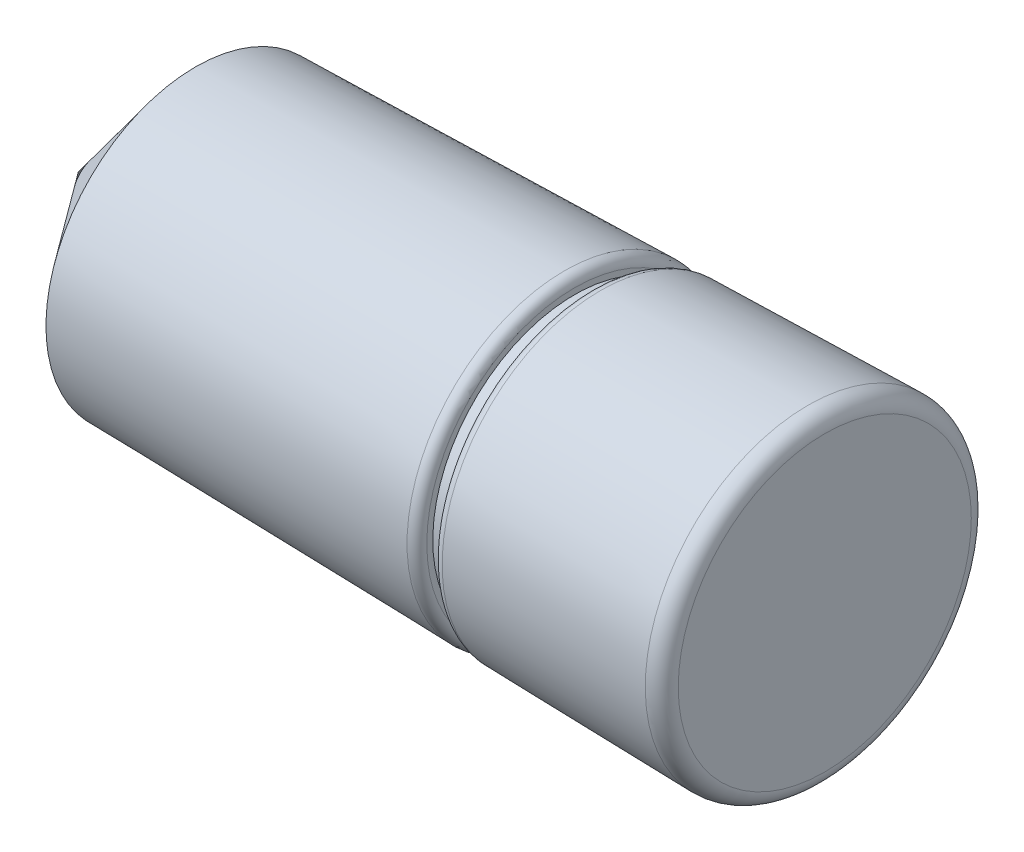
ISO-10303-21;
HEADER;
FILE_DESCRIPTION(('STEP AP214'),'2;1');
FILE_NAME('part.step','',(''),(''),'','','');
FILE_SCHEMA(('AUTOMOTIVE_DESIGN { 1 0 10303 214 1 1 1 1 }'));
ENDSEC;
DATA;
#1=APPLICATION_CONTEXT('core data for automotive mechanical design processes');
#2=APPLICATION_PROTOCOL_DEFINITION('international standard','automotive_design',2000,#1);
#3=PRODUCT_CONTEXT('',#1,'mechanical');
#4=PRODUCT('Part','Part','',(#3));
#5=PRODUCT_RELATED_PRODUCT_CATEGORY('part','',(#4));
#6=PRODUCT_DEFINITION_FORMATION('','',#4);
#7=PRODUCT_DEFINITION_CONTEXT('part definition',#1,'design');
#8=PRODUCT_DEFINITION('design','',#6,#7);
#9=PRODUCT_DEFINITION_SHAPE('','',#8);
#10=(LENGTH_UNIT() NAMED_UNIT(*) SI_UNIT(.MILLI.,.METRE.));
#11=(NAMED_UNIT(*) PLANE_ANGLE_UNIT() SI_UNIT($,.RADIAN.));
#12=(NAMED_UNIT(*) SI_UNIT($,.STERADIAN.) SOLID_ANGLE_UNIT());
#13=UNCERTAINTY_MEASURE_WITH_UNIT(LENGTH_MEASURE(1.E-05),#10,'distance_accuracy_value','');
#14=(GEOMETRIC_REPRESENTATION_CONTEXT(3) GLOBAL_UNCERTAINTY_ASSIGNED_CONTEXT((#13)) GLOBAL_UNIT_ASSIGNED_CONTEXT((#10,
#11,#12)) REPRESENTATION_CONTEXT('',''));
#15=CARTESIAN_POINT('',(0.,0.,0.));
#16=DIRECTION('',(0.,0.,1.));
#17=DIRECTION('',(1.,0.,0.));
#18=AXIS2_PLACEMENT_3D('',#15,#16,#17);
#19=CARTESIAN_POINT('',(534.155129661409,153.717367655894,0.));
#20=DIRECTION('',(-0.999999998221423,-5.96418779812159E-05,0.));
#21=DIRECTION('',(5.96418779812159E-05,-0.999999998221423,0.));
#22=AXIS2_PLACEMENT_3D('',#19,#20,#21);
#23=CONICAL_SURFACE('',#22,14.2530304578427,1.57073668491688);
#24=CARTESIAN_POINT('',(534.155979738912,153.717367706594,0.));
#25=VERTEX_POINT('',#24);
#26=VERTEX_LOOP('',#25);
#27=FACE_BOUND('',#26,.T.);
#28=CARTESIAN_POINT('',(534.155129661409,153.717367655894,0.));
#29=DIRECTION('',(0.999999998221423,5.96418779812159E-05,0.));
#30=DIRECTION('',(-5.96418779812159E-05,0.999999998221423,0.));
#31=AXIS2_PLACEMENT_3D('',#28,#29,#30);
#32=CIRCLE('',#31,14.2530304578427);
#33=CARTESIAN_POINT('',(534.154279583905,167.970398088386,0.));
#34=VERTEX_POINT('',#33);
#35=EDGE_CURVE('E11',#34,#34,#32,.T.);
#36=ORIENTED_EDGE('',*,*,#35,.T.);
#37=EDGE_LOOP('',(#36));
#38=FACE_BOUND('',#37,.T.);
#39=ADVANCED_FACE('F33',(#27,#38),#23,.T.);
#40=CARTESIAN_POINT('',(532.567629667056,153.717272974412,0.));
#41=DIRECTION('',(0.999999998221423,5.96418779812159E-05,0.));
#42=DIRECTION('',(-5.96418779812159E-05,0.999999998221423,0.));
#43=AXIS2_PLACEMENT_3D('',#40,#41,#42);
#44=TOROIDAL_SURFACE('',#43,14.2529357763614,1.58749999999998);
#45=ORIENTED_EDGE('',*,*,#35,.F.);
#46=EDGE_LOOP('',(#45));
#47=FACE_BOUND('',#46,.T.);
#48=CARTESIAN_POINT('',(532.533439624122,153.717270935254,0.));
#49=DIRECTION('',(0.999999998221423,5.96418779812159E-05,0.));
#50=DIRECTION('',(-5.96418779812159E-05,0.999999998221423,0.));
#51=AXIS2_PLACEMENT_3D('',#48,#49,#50);
#52=CIRCLE('',#51,15.8400675575818);
#53=CARTESIAN_POINT('',(532.532494892745,169.557338464663,0.));
#54=VERTEX_POINT('',#53);
#55=EDGE_CURVE('E40',#54,#54,#52,.T.);
#56=ORIENTED_EDGE('',*,*,#55,.T.);
#57=EDGE_LOOP('',(#56));
#58=FACE_BOUND('',#57,.T.);
#59=ADVANCED_FACE('F48',(#47,#58),#44,.T.);
#60=CARTESIAN_POINT('',(512.340427262318,153.716066586073,0.));
#61=DIRECTION('',(0.999999998221423,5.96418779812159E-05,0.));
#62=DIRECTION('',(-5.96418779812159E-05,0.999999998221423,0.));
#63=AXIS2_PLACEMENT_3D('',#60,#61,#62);
#64=CONICAL_SURFACE('',#63,15.4050690462788,0.0215387002752738);
#65=CARTESIAN_POINT('',(512.340427262318,153.716066586073,0.));
#66=DIRECTION('',(0.999999998221423,5.96418779812159E-05,0.));
#67=DIRECTION('',(-5.96418779812159E-05,0.999999998221423,0.));
#68=AXIS2_PLACEMENT_3D('',#65,#66,#67);
#69=CIRCLE('',#68,15.4050690462788);
#70=CARTESIAN_POINT('',(512.33950847507,169.121135604952,0.));
#71=VERTEX_POINT('',#70);
#72=EDGE_CURVE('E57',#71,#71,#69,.T.);
#73=CARTESIAN_POINT('',(532.532494892745,169.557338464663,0.));
#74=CARTESIAN_POINT('',(532.322151284228,169.552794684874,0.));
#75=CARTESIAN_POINT('',(532.11180767571,169.548250905086,0.));
#76=CARTESIAN_POINT('',(531.691120458676,169.539163345509,0.));
#77=CARTESIAN_POINT('',(531.480776850158,169.53461956572,0.));
#78=CARTESIAN_POINT('',(531.060089633123,169.525532006143,0.));
#79=CARTESIAN_POINT('',(530.849746024606,169.520988226354,0.));
#80=CARTESIAN_POINT('',(530.429058807571,169.511900666777,0.));
#81=CARTESIAN_POINT('',(530.218715199053,169.507356886988,0.));
#82=CARTESIAN_POINT('',(529.798027982018,169.498269327411,0.));
#83=CARTESIAN_POINT('',(529.587684373501,169.493725547622,0.));
#84=CARTESIAN_POINT('',(529.166997156466,169.484637988045,0.));
#85=CARTESIAN_POINT('',(528.956653547949,169.480094208256,0.));
#86=CARTESIAN_POINT('',(528.535966330914,169.471006648679,0.));
#87=CARTESIAN_POINT('',(528.325622722396,169.46646286889,0.));
#88=CARTESIAN_POINT('',(527.904935505361,169.457375309313,0.));
#89=CARTESIAN_POINT('',(527.694591896844,169.452831529524,0.));
#90=CARTESIAN_POINT('',(527.273904679809,169.443743969947,0.));
#91=CARTESIAN_POINT('',(527.063561071292,169.439200190158,0.));
#92=CARTESIAN_POINT('',(526.642873854257,169.430112630581,0.));
#93=CARTESIAN_POINT('',(526.432530245739,169.425568850792,0.));
#94=CARTESIAN_POINT('',(526.011843028704,169.416481291215,0.));
#95=CARTESIAN_POINT('',(525.801499420187,169.411937511426,0.));
#96=CARTESIAN_POINT('',(525.380812203152,169.402849951849,0.));
#97=CARTESIAN_POINT('',(525.170468594634,169.39830617206,0.));
#98=CARTESIAN_POINT('',(524.7497813776,169.389218612483,0.));
#99=CARTESIAN_POINT('',(524.539437769082,169.384674832694,0.));
#100=CARTESIAN_POINT('',(524.118750552047,169.375587273117,0.));
#101=CARTESIAN_POINT('',(523.90840694353,169.371043493328,0.));
#102=CARTESIAN_POINT('',(523.487719726495,169.361955933751,0.));
#103=CARTESIAN_POINT('',(523.277376117977,169.357412153962,0.));
#104=CARTESIAN_POINT('',(522.856688900943,169.348324594385,0.));
#105=CARTESIAN_POINT('',(522.646345292425,169.343780814596,0.));
#106=CARTESIAN_POINT('',(522.22565807539,169.334693255019,0.));
#107=CARTESIAN_POINT('',(522.015314466873,169.33014947523,0.));
#108=CARTESIAN_POINT('',(521.594627249838,169.321061915653,0.));
#109=CARTESIAN_POINT('',(521.38428364132,169.316518135864,0.));
#110=CARTESIAN_POINT('',(520.963596424285,169.307430576287,0.));
#111=CARTESIAN_POINT('',(520.753252815768,169.302886796499,0.));
#112=CARTESIAN_POINT('',(520.332565598733,169.293799236921,0.));
#113=CARTESIAN_POINT('',(520.122221990216,169.289255457133,0.));
#114=CARTESIAN_POINT('',(519.701534773181,169.280167897555,0.));
#115=CARTESIAN_POINT('',(519.491191164663,169.275624117767,0.));
#116=CARTESIAN_POINT('',(519.070503947628,169.266536558189,0.));
#117=CARTESIAN_POINT('',(518.860160339111,169.261992778401,0.));
#118=CARTESIAN_POINT('',(518.439473122076,169.252905218823,0.));
#119=CARTESIAN_POINT('',(518.229129513559,169.248361439035,0.));
#120=CARTESIAN_POINT('',(517.808442296524,169.239273879457,0.));
#121=CARTESIAN_POINT('',(517.598098688006,169.234730099669,0.));
#122=CARTESIAN_POINT('',(517.177411470971,169.225642540091,0.));
#123=CARTESIAN_POINT('',(516.967067862454,169.221098760303,0.));
#124=CARTESIAN_POINT('',(516.546380645419,169.212011200725,0.));
#125=CARTESIAN_POINT('',(516.336037036902,169.207467420937,0.));
#126=CARTESIAN_POINT('',(515.915349819867,169.198379861359,0.));
#127=CARTESIAN_POINT('',(515.705006211349,169.193836081571,0.));
#128=CARTESIAN_POINT('',(515.284318994314,169.184748521993,0.));
#129=CARTESIAN_POINT('',(515.073975385797,169.180204742205,0.));
#130=CARTESIAN_POINT('',(514.653288168762,169.171117182628,0.));
#131=CARTESIAN_POINT('',(514.442944560245,169.166573402839,0.));
#132=CARTESIAN_POINT('',(514.02225734321,169.157485843262,0.));
#133=CARTESIAN_POINT('',(513.811913734692,169.152942063473,0.));
#134=CARTESIAN_POINT('',(513.391226517657,169.143854503896,0.));
#135=CARTESIAN_POINT('',(513.18088290914,169.139310724107,0.));
#136=CARTESIAN_POINT('',(512.760195692105,169.13022316453,0.));
#137=CARTESIAN_POINT('',(512.549852083587,169.125679384741,0.));
#138=CARTESIAN_POINT('',(512.33950847507,169.121135604952,0.));
#139=B_SPLINE_CURVE_WITH_KNOTS('',3,(#73,#74,#75,#76,#77,#78,#79,#80,#81,#82,#83,#84,#85,#86,
#87,#88,#89,#90,#91,#92,#93,#94,#95,#96,#97,#98,#99,#100,#101,#102,#103,#104,#105,#106,#107,
#108,#109,#110,#111,#112,#113,#114,#115,#116,#117,#118,#119,#120,#121,#122,#123,#124,#125,#126,
#127,#128,#129,#130,#131,#132,#133,#134,#135,#136,#137,#138),.UNSPECIFIED.,.F.,.F.,(4,2,2,2,2,2,
2,2,2,2,2,2,2,2,2,2,2,2,2,2,2,2,2,2,2,2,2,2,2,2,2,2,4),(0.,0.631178038441001,1.262356076882,
1.893534115323,2.524712153764,3.15589019220489,3.78706823064589,4.4182462690869,
5.04942430752779,5.68060234596879,6.31178038440979,6.94295842285079,7.57413646129179,
8.20531449973268,8.83649253817368,9.46767057661457,10.0988486150556,10.7300266534967,
11.3612046919376,11.9923827303786,12.6235607688195,13.2547388072605,13.8859168457015,
14.5170948841424,15.1482729225835,15.7794509610244,16.4106289994654,17.0418070379064,
17.6729850763472,18.3041631147882,18.9353411532291,19.5665191916701,20.1976972301112),.UNSPECIFIED.);
#140=EDGE_CURVE('BSEAM53',#54,#71,#139,.T.);
#141=ORIENTED_EDGE('',*,*,#55,.F.);
#142=ORIENTED_EDGE('',*,*,#72,.T.);
#143=ORIENTED_EDGE('',*,*,#140,.T.);
#144=ORIENTED_EDGE('',*,*,#140,.F.);
#145=EDGE_LOOP('',(#141,#143,#142,#144));
#146=FACE_BOUND('',#145,.T.);
#147=ADVANCED_FACE('F53',(#146),#64,.T.);
#148=CARTESIAN_POINT('',(512.360941288079,153.716067809568,0.));
#149=DIRECTION('',(0.999999998221423,5.96418779812159E-05,0.));
#150=DIRECTION('',(-5.96418779812159E-05,0.999999998221423,0.));
#151=AXIS2_PLACEMENT_3D('',#148,#149,#150);
#152=TOROIDAL_SURFACE('',#151,14.4527899775465,0.952500000000013);
#153=ORIENTED_EDGE('',*,*,#72,.F.);
#154=EDGE_LOOP('',(#153));
#155=FACE_BOUND('',#154,.T.);
#156=CARTESIAN_POINT('',(511.408441291467,153.716011000679,0.));
#157=DIRECTION('',(0.999999998221423,5.96418779812159E-05,0.));
#158=DIRECTION('',(-5.96418779812159E-05,0.999999998221423,0.));
#159=AXIS2_PLACEMENT_3D('',#156,#157,#158);
#160=CIRCLE('',#159,14.4527331686577);
#161=CARTESIAN_POINT('',(511.409303279615,139.263277858656,0.));
#162=VERTEX_POINT('',#161);
#163=EDGE_CURVE('E59',#162,#162,#160,.T.);
#164=ORIENTED_EDGE('',*,*,#163,.T.);
#165=EDGE_LOOP('',(#164));
#166=FACE_BOUND('',#165,.T.);
#167=ADVANCED_FACE('F106',(#155,#166),#152,.T.);
#168=CARTESIAN_POINT('',(511.408480371342,153.71601100301,0.));
#169=DIRECTION('',(-0.999999998221423,-5.96418779812159E-05,0.));
#170=DIRECTION('',(5.96418779812159E-05,-0.999999998221423,0.));
#171=AXIS2_PLACEMENT_3D('',#168,#169,#170);
#172=CONICAL_SURFACE('',#171,13.7974909800541,1.57073668491687);
#173=CARTESIAN_POINT('',(511.408480371342,153.71601100301,0.));
#174=DIRECTION('',(0.999999998221423,5.96418779812159E-05,0.));
#175=DIRECTION('',(-5.96418779812159E-05,0.999999998221423,0.));
#176=AXIS2_PLACEMENT_3D('',#173,#174,#175);
#177=CIRCLE('',#176,13.7974909800541);
#178=CARTESIAN_POINT('',(511.409303279615,139.918520046757,0.));
#179=VERTEX_POINT('',#178);
#180=EDGE_CURVE('E64',#179,#179,#177,.T.);
#181=CARTESIAN_POINT('',(511.409303279615,139.263277858656,0.));
#182=CARTESIAN_POINT('',(511.409303279615,139.270103298115,0.));
#183=CARTESIAN_POINT('',(511.409303279615,139.276928737575,0.));
#184=CARTESIAN_POINT('',(511.409303279615,139.290579616494,0.));
#185=CARTESIAN_POINT('',(511.409303279615,139.297405055953,0.));
#186=CARTESIAN_POINT('',(511.409303279615,139.311055934872,0.));
#187=CARTESIAN_POINT('',(511.409303279615,139.317881374331,0.));
#188=CARTESIAN_POINT('',(511.409303279615,139.33153225325,0.));
#189=CARTESIAN_POINT('',(511.409303279615,139.338357692709,0.));
#190=CARTESIAN_POINT('',(511.409303279615,139.352008571628,0.));
#191=CARTESIAN_POINT('',(511.409303279615,139.358834011087,0.));
#192=CARTESIAN_POINT('',(511.409303279615,139.372484890006,0.));
#193=CARTESIAN_POINT('',(511.409303279615,139.379310329466,0.));
#194=CARTESIAN_POINT('',(511.409303279615,139.392961208384,0.));
#195=CARTESIAN_POINT('',(511.409303279615,139.399786647844,0.));
#196=CARTESIAN_POINT('',(511.409303279615,139.413437526762,0.));
#197=CARTESIAN_POINT('',(511.409303279615,139.420262966222,0.));
#198=CARTESIAN_POINT('',(511.409303279615,139.433913845141,0.));
#199=CARTESIAN_POINT('',(511.409303279615,139.4407392846,0.));
#200=CARTESIAN_POINT('',(511.409303279615,139.454390163519,0.));
#201=CARTESIAN_POINT('',(511.409303279615,139.461215602978,0.));
#202=CARTESIAN_POINT('',(511.409303279615,139.474866481897,0.));
#203=CARTESIAN_POINT('',(511.409303279615,139.481691921356,0.));
#204=CARTESIAN_POINT('',(511.409303279615,139.495342800275,0.));
#205=CARTESIAN_POINT('',(511.409303279615,139.502168239734,0.));
#206=CARTESIAN_POINT('',(511.409303279615,139.515819118653,0.));
#207=CARTESIAN_POINT('',(511.409303279615,139.522644558113,0.));
#208=CARTESIAN_POINT('',(511.409303279615,139.536295437031,0.));
#209=CARTESIAN_POINT('',(511.409303279615,139.543120876491,0.));
#210=CARTESIAN_POINT('',(511.409303279615,139.556771755409,0.));
#211=CARTESIAN_POINT('',(511.409303279615,139.563597194869,0.));
#212=CARTESIAN_POINT('',(511.409303279615,139.577248073788,0.));
#213=CARTESIAN_POINT('',(511.409303279615,139.584073513247,0.));
#214=CARTESIAN_POINT('',(511.409303279615,139.597724392166,0.));
#215=CARTESIAN_POINT('',(511.409303279615,139.604549831625,0.));
#216=CARTESIAN_POINT('',(511.409303279615,139.618200710544,0.));
#217=CARTESIAN_POINT('',(511.409303279615,139.625026150003,0.));
#218=CARTESIAN_POINT('',(511.409303279615,139.638677028922,0.));
#219=CARTESIAN_POINT('',(511.409303279615,139.645502468381,0.));
#220=CARTESIAN_POINT('',(511.409303279615,139.6591533473,0.));
#221=CARTESIAN_POINT('',(511.409303279615,139.66597878676,0.));
#222=CARTESIAN_POINT('',(511.409303279615,139.679629665678,0.));
#223=CARTESIAN_POINT('',(511.409303279615,139.686455105138,0.));
#224=CARTESIAN_POINT('',(511.409303279615,139.700105984056,0.));
#225=CARTESIAN_POINT('',(511.409303279615,139.706931423516,0.));
#226=CARTESIAN_POINT('',(511.409303279615,139.720582302435,0.));
#227=CARTESIAN_POINT('',(511.409303279615,139.727407741894,0.));
#228=CARTESIAN_POINT('',(511.409303279615,139.741058620813,0.));
#229=CARTESIAN_POINT('',(511.409303279615,139.747884060272,0.));
#230=CARTESIAN_POINT('',(511.409303279615,139.761534939191,0.));
#231=CARTESIAN_POINT('',(511.409303279615,139.76836037865,0.));
#232=CARTESIAN_POINT('',(511.409303279615,139.782011257569,0.));
#233=CARTESIAN_POINT('',(511.409303279615,139.788836697028,0.));
#234=CARTESIAN_POINT('',(511.409303279615,139.802487575947,0.));
#235=CARTESIAN_POINT('',(511.409303279615,139.809313015407,0.));
#236=CARTESIAN_POINT('',(511.409303279615,139.822963894325,0.));
#237=CARTESIAN_POINT('',(511.409303279615,139.829789333785,0.));
#238=CARTESIAN_POINT('',(511.409303279615,139.843440212703,0.));
#239=CARTESIAN_POINT('',(511.409303279615,139.850265652163,0.));
#240=CARTESIAN_POINT('',(511.409303279615,139.863916531082,0.));
#241=CARTESIAN_POINT('',(511.409303279615,139.870741970541,0.));
#242=CARTESIAN_POINT('',(511.409303279615,139.88439284946,0.));
#243=CARTESIAN_POINT('',(511.409303279615,139.891218288919,0.));
#244=CARTESIAN_POINT('',(511.409303279615,139.904869167838,0.));
#245=CARTESIAN_POINT('',(511.409303279615,139.911694607297,0.));
#246=CARTESIAN_POINT('',(511.409303279615,139.918520046757,0.));
#247=B_SPLINE_CURVE_WITH_KNOTS('',3,(#181,#182,#183,#184,#185,#186,#187,#188,#189,#190,#191,
#192,#193,#194,#195,#196,#197,#198,#199,#200,#201,#202,#203,#204,#205,#206,#207,#208,#209,#210,
#211,#212,#213,#214,#215,#216,#217,#218,#219,#220,#221,#222,#223,#224,#225,#226,#227,#228,#229,
#230,#231,#232,#233,#234,#235,#236,#237,#238,#239,#240,#241,#242,#243,#244,#245,#246),
.UNSPECIFIED.,.F.,.F.,(4,2,2,2,2,2,2,2,2,2,2,2,2,2,2,2,2,2,2,2,2,2,2,2,2,2,2,2,2,2,2,2,4),(0.,
0.0204763183781487,0.0409526367562973,0.061428955134446,0.0819052735125947,0.102381591890716,
0.122857910268892,0.143334228647013,0.163810547025162,0.18428686540331,0.204763183781459,
0.225239502159608,0.245715820537729,0.266192138915877,0.286668457294054,0.307144775672175,
0.327621094050323,0.348097412428472,0.368573730806621,0.389050049184769,0.40952636756289,
0.430002685941039,0.450479004319188,0.470955322697336,0.491431641075485,0.511907959453606,
0.532384277831782,0.552860596209931,0.573336914588052,0.5938132329662,0.614289551344349,
0.634765869722498,0.655242188100619),.UNSPECIFIED.);
#248=EDGE_CURVE('BSEAM102',#162,#179,#247,.T.);
#249=ORIENTED_EDGE('',*,*,#163,.F.);
#250=ORIENTED_EDGE('',*,*,#180,.T.);
#251=ORIENTED_EDGE('',*,*,#248,.T.);
#252=ORIENTED_EDGE('',*,*,#248,.F.);
#253=EDGE_LOOP('',(#249,#251,#250,#252));
#254=FACE_BOUND('',#253,.T.);
#255=ADVANCED_FACE('F102',(#254),#172,.F.);
#256=CARTESIAN_POINT('',(509.820980376989,153.715916321529,0.));
#257=DIRECTION('',(0.999999998221423,5.96418779812159E-05,0.));
#258=DIRECTION('',(-5.96418779812159E-05,0.999999998221423,0.));
#259=AXIS2_PLACEMENT_3D('',#256,#257,#258);
#260=CONICAL_SURFACE('',#259,13.7973962985728,5.96418780158988E-05);
#261=ORIENTED_EDGE('',*,*,#180,.F.);
#262=EDGE_LOOP('',(#261));
#263=FACE_BOUND('',#262,.T.);
#264=CARTESIAN_POINT('',(509.820980376989,153.715916321529,0.));
#265=DIRECTION('',(0.999999998221423,5.96418779812159E-05,0.));
#266=DIRECTION('',(-5.96418779812159E-05,0.999999998221423,0.));
#267=AXIS2_PLACEMENT_3D('',#264,#265,#266);
#268=CIRCLE('',#267,13.7973962985728);
#269=CARTESIAN_POINT('',(509.821803279615,139.918520047713,0.));
#270=VERTEX_POINT('',#269);
#271=EDGE_CURVE('E67',#270,#270,#268,.T.);
#272=ORIENTED_EDGE('',*,*,#271,.T.);
#273=EDGE_LOOP('',(#272));
#274=FACE_BOUND('',#273,.T.);
#275=ADVANCED_FACE('F98',(#263,#274),#260,.T.);
#276=CARTESIAN_POINT('',(509.820945771874,153.715916319465,0.));
#277=DIRECTION('',(-0.999999998221423,-5.96418779812159E-05,0.));
#278=DIRECTION('',(5.96418779812159E-05,-0.999999998221423,0.));
#279=AXIS2_PLACEMENT_3D('',#276,#277,#278);
#280=CONICAL_SURFACE('',#279,14.3776113375786,1.57073668491689);
#281=CARTESIAN_POINT('',(509.820945771874,153.715916319465,0.));
#282=DIRECTION('',(0.999999998221423,5.96418779812159E-05,0.));
#283=DIRECTION('',(-5.96418779812159E-05,0.999999998221423,0.));
#284=AXIS2_PLACEMENT_3D('',#281,#282,#283);
#285=CIRCLE('',#284,14.3776113375787);
#286=CARTESIAN_POINT('',(509.821803279615,139.338305007802,0.));
#287=VERTEX_POINT('',#286);
#288=EDGE_CURVE('E70',#287,#287,#285,.T.);
#289=CARTESIAN_POINT('',(509.821803279615,139.918520047713,0.));
#290=CARTESIAN_POINT('',(509.821803279615,139.912476141047,0.));
#291=CARTESIAN_POINT('',(509.821803279615,139.906432234382,0.));
#292=CARTESIAN_POINT('',(509.821803279615,139.89434442105,0.));
#293=CARTESIAN_POINT('',(509.821803279615,139.888300514384,0.));
#294=CARTESIAN_POINT('',(509.821803279615,139.876212701053,0.));
#295=CARTESIAN_POINT('',(509.821803279615,139.870168794387,0.));
#296=CARTESIAN_POINT('',(509.821803279615,139.858080981056,0.));
#297=CARTESIAN_POINT('',(509.821803279615,139.85203707439,0.));
#298=CARTESIAN_POINT('',(509.821803279615,139.839949261058,0.));
#299=CARTESIAN_POINT('',(509.821803279615,139.833905354393,0.));
#300=CARTESIAN_POINT('',(509.821803279615,139.821817541061,0.));
#301=CARTESIAN_POINT('',(509.821803279615,139.815773634396,0.));
#302=CARTESIAN_POINT('',(509.821803279615,139.803685821064,0.));
#303=CARTESIAN_POINT('',(509.821803279615,139.797641914398,0.));
#304=CARTESIAN_POINT('',(509.821803279615,139.785554101067,0.));
#305=CARTESIAN_POINT('',(509.821803279615,139.779510194401,0.));
#306=CARTESIAN_POINT('',(509.821803279615,139.76742238107,0.));
#307=CARTESIAN_POINT('',(509.821803279615,139.761378474404,0.));
#308=CARTESIAN_POINT('',(509.821803279615,139.749290661072,0.));
#309=CARTESIAN_POINT('',(509.821803279615,139.743246754407,0.));
#310=CARTESIAN_POINT('',(509.821803279615,139.731158941075,0.));
#311=CARTESIAN_POINT('',(509.821803279615,139.725115034409,0.));
#312=CARTESIAN_POINT('',(509.821803279615,139.713027221078,0.));
#313=CARTESIAN_POINT('',(509.821803279615,139.706983314412,0.));
#314=CARTESIAN_POINT('',(509.821803279615,139.694895501081,0.));
#315=CARTESIAN_POINT('',(509.821803279615,139.688851594415,0.));
#316=CARTESIAN_POINT('',(509.821803279615,139.676763781084,0.));
#317=CARTESIAN_POINT('',(509.821803279615,139.670719874418,0.));
#318=CARTESIAN_POINT('',(509.821803279615,139.658632061086,0.));
#319=CARTESIAN_POINT('',(509.821803279615,139.652588154421,0.));
#320=CARTESIAN_POINT('',(509.821803279615,139.640500341089,0.));
#321=CARTESIAN_POINT('',(509.821803279615,139.634456434423,0.));
#322=CARTESIAN_POINT('',(509.821803279615,139.622368621092,0.));
#323=CARTESIAN_POINT('',(509.821803279615,139.616324714426,0.));
#324=CARTESIAN_POINT('',(509.821803279615,139.604236901095,0.));
#325=CARTESIAN_POINT('',(509.821803279615,139.598192994429,0.));
#326=CARTESIAN_POINT('',(509.821803279615,139.586105181098,0.));
#327=CARTESIAN_POINT('',(509.821803279615,139.580061274432,0.));
#328=CARTESIAN_POINT('',(509.821803279615,139.5679734611,0.));
#329=CARTESIAN_POINT('',(509.821803279615,139.561929554435,0.));
#330=CARTESIAN_POINT('',(509.821803279615,139.549841741103,0.));
#331=CARTESIAN_POINT('',(509.821803279615,139.543797834437,0.));
#332=CARTESIAN_POINT('',(509.821803279615,139.531710021106,0.));
#333=CARTESIAN_POINT('',(509.821803279615,139.52566611444,0.));
#334=CARTESIAN_POINT('',(509.821803279615,139.513578301109,0.));
#335=CARTESIAN_POINT('',(509.821803279615,139.507534394443,0.));
#336=CARTESIAN_POINT('',(509.821803279615,139.495446581112,0.));
#337=CARTESIAN_POINT('',(509.821803279615,139.489402674446,0.));
#338=CARTESIAN_POINT('',(509.821803279615,139.477314861114,0.));
#339=CARTESIAN_POINT('',(509.821803279615,139.471270954449,0.));
#340=CARTESIAN_POINT('',(509.821803279615,139.459183141117,0.));
#341=CARTESIAN_POINT('',(509.821803279615,139.453139234451,0.));
#342=CARTESIAN_POINT('',(509.821803279615,139.44105142112,0.));
#343=CARTESIAN_POINT('',(509.821803279615,139.435007514454,0.));
#344=CARTESIAN_POINT('',(509.821803279615,139.422919701123,0.));
#345=CARTESIAN_POINT('',(509.821803279615,139.416875794457,0.));
#346=CARTESIAN_POINT('',(509.821803279615,139.404787981125,0.));
#347=CARTESIAN_POINT('',(509.821803279615,139.39874407446,0.));
#348=CARTESIAN_POINT('',(509.821803279615,139.386656261128,0.));
#349=CARTESIAN_POINT('',(509.821803279615,139.380612354463,0.));
#350=CARTESIAN_POINT('',(509.821803279615,139.368524541131,0.));
#351=CARTESIAN_POINT('',(509.821803279615,139.362480634465,0.));
#352=CARTESIAN_POINT('',(509.821803279615,139.350392821134,0.));
#353=CARTESIAN_POINT('',(509.821803279615,139.344348914468,0.));
#354=CARTESIAN_POINT('',(509.821803279615,139.338305007802,0.));
#355=B_SPLINE_CURVE_WITH_KNOTS('',3,(#289,#290,#291,#292,#293,#294,#295,#296,#297,#298,#299,
#300,#301,#302,#303,#304,#305,#306,#307,#308,#309,#310,#311,#312,#313,#314,#315,#316,#317,#318,
#319,#320,#321,#322,#323,#324,#325,#326,#327,#328,#329,#330,#331,#332,#333,#334,#335,#336,#337,
#338,#339,#340,#341,#342,#343,#344,#345,#346,#347,#348,#349,#350,#351,#352,#353,#354),
.UNSPECIFIED.,.F.,.F.,(4,2,2,2,2,2,2,2,2,2,2,2,2,2,2,2,2,2,2,2,2,2,2,2,2,2,2,2,2,2,2,2,4),(0.,
0.0181317199971776,0.0362634399943829,0.0543951599916159,0.0725268799888212,0.0906585999859988,
0.108790319983204,0.126922039980437,0.145053759977642,0.163185479974848,0.181317199972053,
0.199448919969258,0.217580639966464,0.235712359963697,0.253844079960874,0.27197579995808,
0.290107519955313,0.308239239952518,0.326370959949696,0.344502679946901,0.362634399944134,
0.380766119941339,0.398897839938517,0.41702955993575,0.435161279932955,0.45329299993016,
0.471424719927366,0.489556439924571,0.507688159921776,0.525819879919009,0.543951599916187,
0.562083319913392,0.580215039910625),.UNSPECIFIED.);
#356=EDGE_CURVE('BSEAM94',#270,#287,#355,.T.);
#357=ORIENTED_EDGE('',*,*,#271,.F.);
#358=ORIENTED_EDGE('',*,*,#288,.T.);
#359=ORIENTED_EDGE('',*,*,#356,.T.);
#360=ORIENTED_EDGE('',*,*,#356,.F.);
#361=EDGE_LOOP('',(#357,#359,#358,#360));
#362=FACE_BOUND('',#361,.T.);
#363=ADVANCED_FACE('F94',(#362),#280,.T.);
#364=CARTESIAN_POINT('',(508.868445775262,153.715859510576,0.));
#365=DIRECTION('',(0.999999998221423,5.96418779812159E-05,0.));
#366=DIRECTION('',(-5.96418779812159E-05,0.999999998221423,0.));
#367=AXIS2_PLACEMENT_3D('',#364,#365,#366);
#368=TOROIDAL_SURFACE('',#367,14.3775545286899,0.952500000000013);
#369=ORIENTED_EDGE('',*,*,#288,.F.);
#370=EDGE_LOOP('',(#369));
#371=FACE_BOUND('',#370,.T.);
#372=CARTESIAN_POINT('',(508.847931749502,153.715858287081,0.));
#373=DIRECTION('',(0.999999998221423,5.96418779812159E-05,0.));
#374=DIRECTION('',(-5.96418779812159E-05,0.999999998221423,0.));
#375=AXIS2_PLACEMENT_3D('',#372,#373,#374);
#376=CIRCLE('',#375,15.3298335974222);
#377=CARTESIAN_POINT('',(508.847017449437,169.045691857238,0.));
#378=VERTEX_POINT('',#377);
#379=EDGE_CURVE('E73',#378,#378,#376,.T.);
#380=ORIENTED_EDGE('',*,*,#379,.T.);
#381=EDGE_LOOP('',(#380));
#382=FACE_BOUND('',#381,.T.);
#383=ADVANCED_FACE('F88',(#371,#382),#368,.T.);
#384=CARTESIAN_POINT('',(472.952671398884,153.713717426339,0.));
#385=DIRECTION('',(0.999999998221423,5.96418779812159E-05,0.));
#386=DIRECTION('',(-5.96418779812159E-05,0.999999998221423,0.));
#387=AXIS2_PLACEMENT_3D('',#384,#385,#386);
#388=CONICAL_SURFACE('',#387,14.5565767630486,0.0215387002752749);
#389=CARTESIAN_POINT('',(472.952671398884,153.713717426339,0.));
#390=DIRECTION('',(0.999999998221423,5.96418779812159E-05,0.));
#391=DIRECTION('',(-5.96418779812159E-05,0.999999998221423,0.));
#392=AXIS2_PLACEMENT_3D('',#389,#390,#391);
#393=CIRCLE('',#392,14.5565767630486);
#394=CARTESIAN_POINT('',(472.951803217309,168.270294163498,0.));
#395=VERTEX_POINT('',#394);
#396=EDGE_CURVE('E76',#395,#395,#393,.T.);
#397=CARTESIAN_POINT('',(508.847017449437,169.045691857238,0.));
#398=CARTESIAN_POINT('',(508.473108967852,169.037614797928,0.));
#399=CARTESIAN_POINT('',(508.099200486268,169.029537738618,0.));
#400=CARTESIAN_POINT('',(507.351383523098,169.013383619999,0.));
#401=CARTESIAN_POINT('',(506.977475041514,169.005306560689,0.));
#402=CARTESIAN_POINT('',(506.229658078344,168.989152442069,0.));
#403=CARTESIAN_POINT('',(505.85574959676,168.98107538276,0.));
#404=CARTESIAN_POINT('',(505.10793263359,168.96492126414,0.));
#405=CARTESIAN_POINT('',(504.734024152006,168.95684420483,0.));
#406=CARTESIAN_POINT('',(503.986207188836,168.940690086211,0.));
#407=CARTESIAN_POINT('',(503.612298707252,168.932613026901,0.));
#408=CARTESIAN_POINT('',(502.864481744082,168.916458908281,0.));
#409=CARTESIAN_POINT('',(502.490573262498,168.908381848971,0.));
#410=CARTESIAN_POINT('',(501.742756299328,168.892227730352,0.));
#411=CARTESIAN_POINT('',(501.368847817743,168.884150671042,0.));
#412=CARTESIAN_POINT('',(500.621030854574,168.867996552422,0.));
#413=CARTESIAN_POINT('',(500.24712237299,168.859919493113,0.));
#414=CARTESIAN_POINT('',(499.49930540982,168.843765374493,0.));
#415=CARTESIAN_POINT('',(499.125396928235,168.835688315183,0.));
#416=CARTESIAN_POINT('',(498.377579965066,168.819534196564,0.));
#417=CARTESIAN_POINT('',(498.003671483481,168.811457137254,0.));
#418=CARTESIAN_POINT('',(497.255854520312,168.795303018634,0.));
#419=CARTESIAN_POINT('',(496.881946038727,168.787225959325,0.));
#420=CARTESIAN_POINT('',(496.134129075558,168.771071840705,0.));
#421=CARTESIAN_POINT('',(495.760220593973,168.762994781395,0.));
#422=CARTESIAN_POINT('',(495.012403630804,168.746840662776,0.));
#423=CARTESIAN_POINT('',(494.638495149219,168.738763603466,0.));
#424=CARTESIAN_POINT('',(493.89067818605,168.722609484846,0.));
#425=CARTESIAN_POINT('',(493.516769704465,168.714532425536,0.));
#426=CARTESIAN_POINT('',(492.768952741296,168.698378306917,0.));
#427=CARTESIAN_POINT('',(492.395044259711,168.690301247607,0.));
#428=CARTESIAN_POINT('',(491.647227296542,168.674147128987,0.));
#429=CARTESIAN_POINT('',(491.273318814957,168.666070069678,0.));
#430=CARTESIAN_POINT('',(490.525501851788,168.649915951058,0.));
#431=CARTESIAN_POINT('',(490.151593370203,168.641838891748,0.));
#432=CARTESIAN_POINT('',(489.403776407034,168.625684773129,0.));
#433=CARTESIAN_POINT('',(489.029867925449,168.617607713819,0.));
#434=CARTESIAN_POINT('',(488.28205096228,168.601453595199,0.));
#435=CARTESIAN_POINT('',(487.908142480695,168.59337653589,0.));
#436=CARTESIAN_POINT('',(487.160325517526,168.57722241727,0.));
#437=CARTESIAN_POINT('',(486.786417035941,168.56914535796,0.));
#438=CARTESIAN_POINT('',(486.038600072772,168.552991239341,0.));
#439=CARTESIAN_POINT('',(485.664691591187,168.544914180031,0.));
#440=CARTESIAN_POINT('',(484.916874628018,168.528760061411,0.));
#441=CARTESIAN_POINT('',(484.542966146433,168.520683002101,0.));
#442=CARTESIAN_POINT('',(483.795149183264,168.504528883482,0.));
#443=CARTESIAN_POINT('',(483.421240701679,168.496451824172,0.));
#444=CARTESIAN_POINT('',(482.67342373851,168.480297705552,0.));
#445=CARTESIAN_POINT('',(482.299515256925,168.472220646243,0.));
#446=CARTESIAN_POINT('',(481.551698293756,168.456066527623,0.));
#447=CARTESIAN_POINT('',(481.177789812171,168.447989468313,0.));
#448=CARTESIAN_POINT('',(480.429972849002,168.431835349694,0.));
#449=CARTESIAN_POINT('',(480.056064367417,168.423758290384,0.));
#450=CARTESIAN_POINT('',(479.308247404248,168.407604171764,0.));
#451=CARTESIAN_POINT('',(478.934338922663,168.399527112455,0.));
#452=CARTESIAN_POINT('',(478.186521959494,168.383372993835,0.));
#453=CARTESIAN_POINT('',(477.812613477909,168.375295934525,0.));
#454=CARTESIAN_POINT('',(477.06479651474,168.359141815906,0.));
#455=CARTESIAN_POINT('',(476.690888033155,168.351064756596,0.));
#456=CARTESIAN_POINT('',(475.943071069986,168.334910637976,0.));
#457=CARTESIAN_POINT('',(475.569162588401,168.326833578666,0.));
#458=CARTESIAN_POINT('',(474.821345625232,168.310679460047,0.));
#459=CARTESIAN_POINT('',(474.447437143647,168.302602400737,0.));
#460=CARTESIAN_POINT('',(473.699620180478,168.286448282117,0.));
#461=CARTESIAN_POINT('',(473.325711698893,168.278371222808,0.));
#462=CARTESIAN_POINT('',(472.951803217309,168.270294163498,0.));
#463=B_SPLINE_CURVE_WITH_KNOTS('',3,(#397,#398,#399,#400,#401,#402,#403,#404,#405,#406,#407,
#408,#409,#410,#411,#412,#413,#414,#415,#416,#417,#418,#419,#420,#421,#422,#423,#424,#425,#426,
#427,#428,#429,#430,#431,#432,#433,#434,#435,#436,#437,#438,#439,#440,#441,#442,#443,#444,#445,
#446,#447,#448,#449,#450,#451,#452,#453,#454,#455,#456,#457,#458,#459,#460,#461,#462),
.UNSPECIFIED.,.F.,.F.,(4,2,2,2,2,2,2,2,2,2,2,2,2,2,2,2,2,2,2,2,2,2,2,2,2,2,2,2,2,2,2,2,4),(0.,
1.12198713156283,2.24397426312555,3.36596139468828,4.48794852625111,5.60993565781383,
6.73192278937656,7.85390992093939,8.97589705250211,10.0978841840649,11.2198713156277,
12.3418584471904,13.4638455787531,14.5858327103159,15.7078198418787,16.8298069734414,
17.9517941050042,19.0737812365669,20.1957683681297,21.3177554996925,22.4397426312552,
23.5617297628179,24.6837168943807,25.8057040259435,26.9276911575062,28.049678289069,
29.1716654206318,30.2936525521945,31.4156396837573,32.5376268153201,33.6596139468828,
34.7816010784456,35.9035882100083),.UNSPECIFIED.);
#464=EDGE_CURVE('BSEAM80',#378,#395,#463,.T.);
#465=ORIENTED_EDGE('',*,*,#379,.F.);
#466=ORIENTED_EDGE('',*,*,#396,.T.);
#467=ORIENTED_EDGE('',*,*,#464,.T.);
#468=ORIENTED_EDGE('',*,*,#464,.F.);
#469=EDGE_LOOP('',(#465,#467,#466,#468));
#470=FACE_BOUND('',#469,.T.);
#471=ADVANCED_FACE('F80',(#470),#388,.T.);
#472=CARTESIAN_POINT('',(461.54352052823,153.713036963154,0.));
#473=DIRECTION('',(0.999999998221423,5.96418779812159E-05,0.));
#474=DIRECTION('',(-5.96418779812159E-05,0.999999998221423,0.));
#475=AXIS2_PLACEMENT_3D('',#472,#473,#474);
#476=CONICAL_SURFACE('',#475,0.,0.906024296917396);
#477=ORIENTED_EDGE('',*,*,#396,.F.);
#478=EDGE_LOOP('',(#477));
#479=FACE_BOUND('',#478,.T.);
#480=CARTESIAN_POINT('',(461.54352052823,153.713036963154,0.));
#481=VERTEX_POINT('',#480);
#482=VERTEX_LOOP('',#481);
#483=FACE_BOUND('',#482,.T.);
#484=ADVANCED_FACE('F82',(#479,#483),#476,.T.);
#485=CLOSED_SHELL('',(#39,#59,#147,#167,#255,#275,#363,#383,#471,#484));
#486=MANIFOLD_SOLID_BREP('B2',#485);
#487=ADVANCED_BREP_SHAPE_REPRESENTATION('',(#18,#486),#14);
#488=SHAPE_DEFINITION_REPRESENTATION(#9,#487);
ENDSEC;
END-ISO-10303-21;
